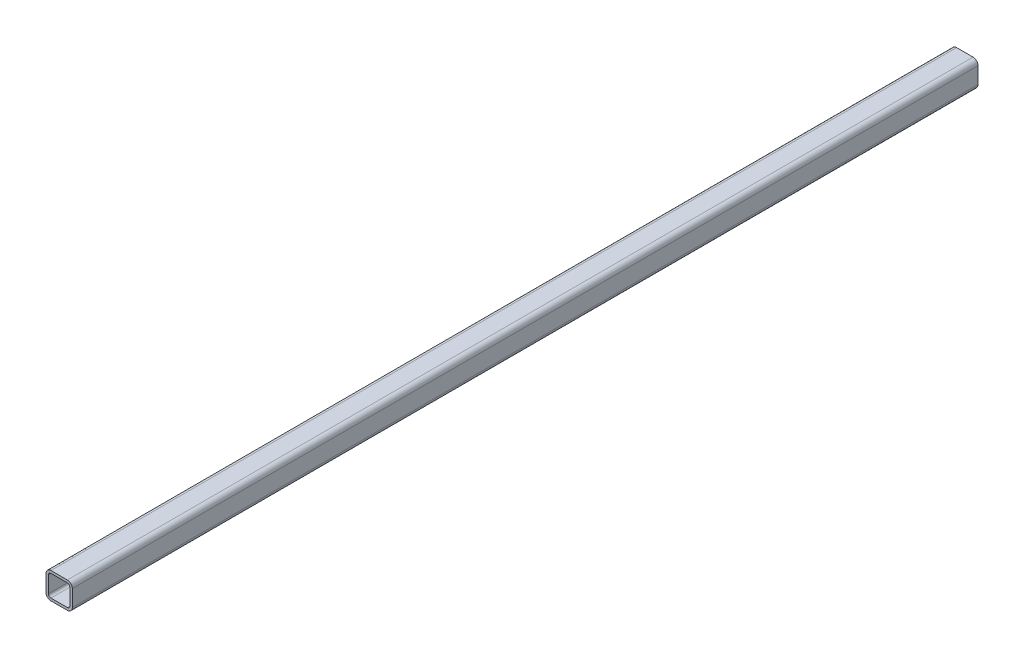
ISO-10303-21;
HEADER;
FILE_DESCRIPTION(('STEP AP214'),'2;1');
FILE_NAME('part.step','',(''),(''),'','','');
FILE_SCHEMA(('AUTOMOTIVE_DESIGN { 1 0 10303 214 1 1 1 1 }'));
ENDSEC;
DATA;
#1=APPLICATION_CONTEXT('core data for automotive mechanical design processes');
#2=APPLICATION_PROTOCOL_DEFINITION('international standard','automotive_design',2000,#1);
#3=PRODUCT_CONTEXT('',#1,'mechanical');
#4=PRODUCT('Part','Part','',(#3));
#5=PRODUCT_RELATED_PRODUCT_CATEGORY('part','',(#4));
#6=PRODUCT_DEFINITION_FORMATION('','',#4);
#7=PRODUCT_DEFINITION_CONTEXT('part definition',#1,'design');
#8=PRODUCT_DEFINITION('design','',#6,#7);
#9=PRODUCT_DEFINITION_SHAPE('','',#8);
#10=(LENGTH_UNIT() NAMED_UNIT(*) SI_UNIT(.MILLI.,.METRE.));
#11=(NAMED_UNIT(*) PLANE_ANGLE_UNIT() SI_UNIT($,.RADIAN.));
#12=(NAMED_UNIT(*) SI_UNIT($,.STERADIAN.) SOLID_ANGLE_UNIT());
#13=UNCERTAINTY_MEASURE_WITH_UNIT(LENGTH_MEASURE(1.E-05),#10,'distance_accuracy_value','');
#14=(GEOMETRIC_REPRESENTATION_CONTEXT(3) GLOBAL_UNCERTAINTY_ASSIGNED_CONTEXT((#13)) GLOBAL_UNIT_ASSIGNED_CONTEXT((#10,
#11,#12)) REPRESENTATION_CONTEXT('',''));
#15=CARTESIAN_POINT('',(0.,0.,0.));
#16=DIRECTION('',(0.,0.,1.));
#17=DIRECTION('',(1.,0.,0.));
#18=AXIS2_PLACEMENT_3D('',#15,#16,#17);
#19=CARTESIAN_POINT('',(41.27,41.27,1749.2));
#20=DIRECTION('',(0.,0.,-1.));
#21=DIRECTION('',(-1.,0.,0.));
#22=AXIS2_PLACEMENT_3D('',#19,#20,#21);
#23=PLANE('',#22);
#24=CARTESIAN_POINT('',(41.27,41.27,1749.2));
#25=DIRECTION('',(0.,0.,1.));
#26=DIRECTION('',(-1.,0.,0.));
#27=AXIS2_PLACEMENT_3D('',#24,#25,#26);
#28=CIRCLE('',#27,9.53);
#29=CARTESIAN_POINT('',(50.8,41.2699999999999,1749.2));
#30=VERTEX_POINT('',#29);
#31=CARTESIAN_POINT('',(41.2699999999999,50.8,1749.2));
#32=VERTEX_POINT('',#31);
#33=EDGE_CURVE('E246',#30,#32,#28,.T.);
#34=ORIENTED_EDGE('',*,*,#33,.T.);
#35=DIRECTION('',(-1.,0.,0.));
#36=VECTOR('',#35,1.);
#37=CARTESIAN_POINT('',(9.53000000000007,50.8,1749.2));
#38=LINE('',#37,#36);
#39=CARTESIAN_POINT('',(9.53000000000007,50.8,1749.2));
#40=VERTEX_POINT('',#39);
#41=EDGE_CURVE('E250',#32,#40,#38,.T.);
#42=ORIENTED_EDGE('',*,*,#41,.T.);
#43=CARTESIAN_POINT('',(9.53,41.27,1749.2));
#44=DIRECTION('',(0.,0.,1.));
#45=DIRECTION('',(-1.,0.,0.));
#46=AXIS2_PLACEMENT_3D('',#43,#44,#45);
#47=CIRCLE('',#46,9.53);
#48=CARTESIAN_POINT('',(0.,41.2699999999999,1749.2));
#49=VERTEX_POINT('',#48);
#50=EDGE_CURVE('E254',#40,#49,#47,.T.);
#51=ORIENTED_EDGE('',*,*,#50,.T.);
#52=DIRECTION('',(0.,-1.,0.));
#53=VECTOR('',#52,1.);
#54=CARTESIAN_POINT('',(0.,9.53000000000007,1749.2));
#55=LINE('',#54,#53);
#56=CARTESIAN_POINT('',(0.,9.53000000000007,1749.2));
#57=VERTEX_POINT('',#56);
#58=EDGE_CURVE('E257',#49,#57,#55,.T.);
#59=ORIENTED_EDGE('',*,*,#58,.T.);
#60=CARTESIAN_POINT('',(9.53,9.53,1749.2));
#61=DIRECTION('',(0.,0.,1.));
#62=DIRECTION('',(-1.,0.,0.));
#63=AXIS2_PLACEMENT_3D('',#60,#61,#62);
#64=CIRCLE('',#63,9.53);
#65=CARTESIAN_POINT('',(9.53000000000007,0.,1749.2));
#66=VERTEX_POINT('',#65);
#67=EDGE_CURVE('E260',#57,#66,#64,.T.);
#68=ORIENTED_EDGE('',*,*,#67,.T.);
#69=DIRECTION('',(1.,0.,0.));
#70=VECTOR('',#69,1.);
#71=CARTESIAN_POINT('',(9.53000000000007,0.,1749.2));
#72=LINE('',#71,#70);
#73=CARTESIAN_POINT('',(41.2699999999999,0.,1749.2));
#74=VERTEX_POINT('',#73);
#75=EDGE_CURVE('E263',#66,#74,#72,.T.);
#76=ORIENTED_EDGE('',*,*,#75,.T.);
#77=CARTESIAN_POINT('',(41.27,9.53,1749.2));
#78=DIRECTION('',(0.,0.,1.));
#79=DIRECTION('',(-1.,0.,0.));
#80=AXIS2_PLACEMENT_3D('',#77,#78,#79);
#81=CIRCLE('',#80,9.53);
#82=CARTESIAN_POINT('',(50.8,9.53000000000007,1749.2));
#83=VERTEX_POINT('',#82);
#84=EDGE_CURVE('E266',#74,#83,#81,.T.);
#85=ORIENTED_EDGE('',*,*,#84,.T.);
#86=DIRECTION('',(0.,1.,0.));
#87=VECTOR('',#86,1.);
#88=CARTESIAN_POINT('',(50.8,9.53000000000007,1749.2));
#89=LINE('',#88,#87);
#90=EDGE_CURVE('E269',#83,#30,#89,.T.);
#91=ORIENTED_EDGE('',*,*,#90,.T.);
#92=EDGE_LOOP('',(#34,#42,#51,#59,#68,#76,#85,#91));
#93=FACE_BOUND('',#92,.T.);
#94=CARTESIAN_POINT('',(9.52,9.52,1749.2));
#95=DIRECTION('',(0.,0.,1.));
#96=DIRECTION('',(1.,0.,0.));
#97=AXIS2_PLACEMENT_3D('',#94,#95,#96);
#98=CIRCLE('',#97,4.76);
#99=CARTESIAN_POINT('',(4.76,9.52000000000003,1749.2));
#100=VERTEX_POINT('',#99);
#101=CARTESIAN_POINT('',(9.52000000000004,4.76,1749.2));
#102=VERTEX_POINT('',#101);
#103=EDGE_CURVE('E157',#100,#102,#98,.T.);
#104=ORIENTED_EDGE('',*,*,#103,.F.);
#105=DIRECTION('',(0.,-1.,0.));
#106=VECTOR('',#105,1.);
#107=CARTESIAN_POINT('',(4.76,41.28,1749.2));
#108=LINE('',#107,#106);
#109=CARTESIAN_POINT('',(4.76,41.28,1749.2));
#110=VERTEX_POINT('',#109);
#111=EDGE_CURVE('E198',#110,#100,#108,.T.);
#112=ORIENTED_EDGE('',*,*,#111,.F.);
#113=CARTESIAN_POINT('',(9.52,41.28,1749.2));
#114=DIRECTION('',(0.,0.,1.));
#115=DIRECTION('',(-1.,0.,0.));
#116=AXIS2_PLACEMENT_3D('',#113,#114,#115);
#117=CIRCLE('',#116,4.76);
#118=CARTESIAN_POINT('',(9.52000000000003,46.04,1749.2));
#119=VERTEX_POINT('',#118);
#120=EDGE_CURVE('E195',#119,#110,#117,.T.);
#121=ORIENTED_EDGE('',*,*,#120,.F.);
#122=DIRECTION('',(-1.,0.,0.));
#123=VECTOR('',#122,1.);
#124=CARTESIAN_POINT('',(9.52000000000003,46.04,1749.2));
#125=LINE('',#124,#123);
#126=CARTESIAN_POINT('',(41.28,46.04,1749.2));
#127=VERTEX_POINT('',#126);
#128=EDGE_CURVE('E192',#127,#119,#125,.T.);
#129=ORIENTED_EDGE('',*,*,#128,.F.);
#130=CARTESIAN_POINT('',(41.28,41.28,1749.2));
#131=DIRECTION('',(0.,0.,1.));
#132=DIRECTION('',(1.,0.,0.));
#133=AXIS2_PLACEMENT_3D('',#130,#131,#132);
#134=CIRCLE('',#133,4.76);
#135=CARTESIAN_POINT('',(46.04,41.28,1749.2));
#136=VERTEX_POINT('',#135);
#137=EDGE_CURVE('E189',#136,#127,#134,.T.);
#138=ORIENTED_EDGE('',*,*,#137,.F.);
#139=DIRECTION('',(0.,1.,0.));
#140=VECTOR('',#139,1.);
#141=CARTESIAN_POINT('',(46.04,41.28,1749.2));
#142=LINE('',#141,#140);
#143=CARTESIAN_POINT('',(46.04,9.52000000000003,1749.2));
#144=VERTEX_POINT('',#143);
#145=EDGE_CURVE('E184',#144,#136,#142,.T.);
#146=ORIENTED_EDGE('',*,*,#145,.F.);
#147=CARTESIAN_POINT('',(41.28,9.52,1749.2));
#148=DIRECTION('',(0.,0.,1.));
#149=DIRECTION('',(1.,0.,0.));
#150=AXIS2_PLACEMENT_3D('',#147,#148,#149);
#151=CIRCLE('',#150,4.76);
#152=CARTESIAN_POINT('',(41.28,4.76,1749.2));
#153=VERTEX_POINT('',#152);
#154=EDGE_CURVE('E180',#153,#144,#151,.T.);
#155=ORIENTED_EDGE('',*,*,#154,.F.);
#156=DIRECTION('',(1.,0.,0.));
#157=VECTOR('',#156,1.);
#158=CARTESIAN_POINT('',(9.52000000000004,4.76,1749.2));
#159=LINE('',#158,#157);
#160=EDGE_CURVE('E166',#102,#153,#159,.T.);
#161=ORIENTED_EDGE('',*,*,#160,.F.);
#162=EDGE_LOOP('',(#104,#112,#121,#129,#138,#146,#155,#161));
#163=FACE_BOUND('',#162,.T.);
#164=ADVANCED_FACE('F43',(#93,#163),#23,.F.);
#165=CARTESIAN_POINT('',(41.27,41.27,0.));
#166=DIRECTION('',(0.,0.,-1.));
#167=DIRECTION('',(-1.,0.,0.));
#168=AXIS2_PLACEMENT_3D('',#165,#166,#167);
#169=PLANE('',#168);
#170=CARTESIAN_POINT('',(41.27,41.27,0.));
#171=DIRECTION('',(0.,0.,1.));
#172=DIRECTION('',(-1.,0.,0.));
#173=AXIS2_PLACEMENT_3D('',#170,#171,#172);
#174=CIRCLE('',#173,9.53);
#175=CARTESIAN_POINT('',(50.8,41.2699999999999,0.));
#176=VERTEX_POINT('',#175);
#177=CARTESIAN_POINT('',(41.2699999999999,50.8,0.));
#178=VERTEX_POINT('',#177);
#179=EDGE_CURVE('E175',#176,#178,#174,.T.);
#180=ORIENTED_EDGE('',*,*,#179,.F.);
#181=DIRECTION('',(0.,1.,0.));
#182=VECTOR('',#181,1.);
#183=CARTESIAN_POINT('',(50.8,9.53000000000007,0.));
#184=LINE('',#183,#182);
#185=CARTESIAN_POINT('',(50.8,9.53000000000007,0.));
#186=VERTEX_POINT('',#185);
#187=EDGE_CURVE('E251',#186,#176,#184,.T.);
#188=ORIENTED_EDGE('',*,*,#187,.F.);
#189=CARTESIAN_POINT('',(41.27,9.53,0.));
#190=DIRECTION('',(0.,0.,1.));
#191=DIRECTION('',(-1.,0.,0.));
#192=AXIS2_PLACEMENT_3D('',#189,#190,#191);
#193=CIRCLE('',#192,9.53);
#194=CARTESIAN_POINT('',(41.2699999999999,0.,0.));
#195=VERTEX_POINT('',#194);
#196=EDGE_CURVE('E291',#195,#186,#193,.T.);
#197=ORIENTED_EDGE('',*,*,#196,.F.);
#198=DIRECTION('',(1.,0.,0.));
#199=VECTOR('',#198,1.);
#200=CARTESIAN_POINT('',(9.53000000000007,0.,0.));
#201=LINE('',#200,#199);
#202=CARTESIAN_POINT('',(9.53000000000007,0.,0.));
#203=VERTEX_POINT('',#202);
#204=EDGE_CURVE('E288',#203,#195,#201,.T.);
#205=ORIENTED_EDGE('',*,*,#204,.F.);
#206=CARTESIAN_POINT('',(9.53,9.53,0.));
#207=DIRECTION('',(0.,0.,1.));
#208=DIRECTION('',(-1.,0.,0.));
#209=AXIS2_PLACEMENT_3D('',#206,#207,#208);
#210=CIRCLE('',#209,9.53);
#211=CARTESIAN_POINT('',(0.,9.53000000000007,0.));
#212=VERTEX_POINT('',#211);
#213=EDGE_CURVE('E285',#212,#203,#210,.T.);
#214=ORIENTED_EDGE('',*,*,#213,.F.);
#215=DIRECTION('',(0.,-1.,0.));
#216=VECTOR('',#215,1.);
#217=CARTESIAN_POINT('',(0.,9.53000000000007,0.));
#218=LINE('',#217,#216);
#219=CARTESIAN_POINT('',(0.,41.2699999999999,0.));
#220=VERTEX_POINT('',#219);
#221=EDGE_CURVE('E282',#220,#212,#218,.T.);
#222=ORIENTED_EDGE('',*,*,#221,.F.);
#223=CARTESIAN_POINT('',(9.53,41.27,0.));
#224=DIRECTION('',(0.,0.,1.));
#225=DIRECTION('',(-1.,0.,0.));
#226=AXIS2_PLACEMENT_3D('',#223,#224,#225);
#227=CIRCLE('',#226,9.53);
#228=CARTESIAN_POINT('',(9.53000000000007,50.8,0.));
#229=VERTEX_POINT('',#228);
#230=EDGE_CURVE('E279',#229,#220,#227,.T.);
#231=ORIENTED_EDGE('',*,*,#230,.F.);
#232=DIRECTION('',(-1.,0.,0.));
#233=VECTOR('',#232,1.);
#234=CARTESIAN_POINT('',(9.53000000000007,50.8,0.));
#235=LINE('',#234,#233);
#236=EDGE_CURVE('E276',#178,#229,#235,.T.);
#237=ORIENTED_EDGE('',*,*,#236,.F.);
#238=EDGE_LOOP('',(#180,#188,#197,#205,#214,#222,#231,#237));
#239=FACE_BOUND('',#238,.T.);
#240=DIRECTION('',(0.,-1.,0.));
#241=VECTOR('',#240,1.);
#242=CARTESIAN_POINT('',(4.76,41.28,0.));
#243=LINE('',#242,#241);
#244=CARTESIAN_POINT('',(4.76,41.28,0.));
#245=VERTEX_POINT('',#244);
#246=CARTESIAN_POINT('',(4.76,9.52000000000004,0.));
#247=VERTEX_POINT('',#246);
#248=EDGE_CURVE('E167',#245,#247,#243,.T.);
#249=ORIENTED_EDGE('',*,*,#248,.T.);
#250=CARTESIAN_POINT('',(9.52,9.52,0.));
#251=DIRECTION('',(0.,0.,1.));
#252=DIRECTION('',(1.,0.,0.));
#253=AXIS2_PLACEMENT_3D('',#250,#251,#252);
#254=CIRCLE('',#253,4.76);
#255=CARTESIAN_POINT('',(9.52000000000004,4.76,0.));
#256=VERTEX_POINT('',#255);
#257=EDGE_CURVE('E67',#247,#256,#254,.T.);
#258=ORIENTED_EDGE('',*,*,#257,.T.);
#259=DIRECTION('',(1.,0.,0.));
#260=VECTOR('',#259,1.);
#261=CARTESIAN_POINT('',(9.52000000000004,4.76,0.));
#262=LINE('',#261,#260);
#263=CARTESIAN_POINT('',(41.28,4.76,0.));
#264=VERTEX_POINT('',#263);
#265=EDGE_CURVE('E173',#256,#264,#262,.T.);
#266=ORIENTED_EDGE('',*,*,#265,.T.);
#267=CARTESIAN_POINT('',(41.28,9.52,0.));
#268=DIRECTION('',(0.,0.,1.));
#269=DIRECTION('',(1.,0.,0.));
#270=AXIS2_PLACEMENT_3D('',#267,#268,#269);
#271=CIRCLE('',#270,4.76);
#272=CARTESIAN_POINT('',(46.04,9.52000000000003,0.));
#273=VERTEX_POINT('',#272);
#274=EDGE_CURVE('E205',#264,#273,#271,.T.);
#275=ORIENTED_EDGE('',*,*,#274,.T.);
#276=DIRECTION('',(0.,1.,0.));
#277=VECTOR('',#276,1.);
#278=CARTESIAN_POINT('',(46.04,41.28,0.));
#279=LINE('',#278,#277);
#280=CARTESIAN_POINT('',(46.04,41.28,0.));
#281=VERTEX_POINT('',#280);
#282=EDGE_CURVE('E209',#273,#281,#279,.T.);
#283=ORIENTED_EDGE('',*,*,#282,.T.);
#284=CARTESIAN_POINT('',(41.28,41.28,0.));
#285=DIRECTION('',(0.,0.,1.));
#286=DIRECTION('',(1.,0.,0.));
#287=AXIS2_PLACEMENT_3D('',#284,#285,#286);
#288=CIRCLE('',#287,4.76);
#289=CARTESIAN_POINT('',(41.28,46.04,0.));
#290=VERTEX_POINT('',#289);
#291=EDGE_CURVE('E213',#281,#290,#288,.T.);
#292=ORIENTED_EDGE('',*,*,#291,.T.);
#293=DIRECTION('',(-1.,0.,0.));
#294=VECTOR('',#293,1.);
#295=CARTESIAN_POINT('',(9.52000000000003,46.04,0.));
#296=LINE('',#295,#294);
#297=CARTESIAN_POINT('',(9.52000000000003,46.04,0.));
#298=VERTEX_POINT('',#297);
#299=EDGE_CURVE('E217',#290,#298,#296,.T.);
#300=ORIENTED_EDGE('',*,*,#299,.T.);
#301=CARTESIAN_POINT('',(9.52,41.28,0.));
#302=DIRECTION('',(0.,0.,1.));
#303=DIRECTION('',(-1.,0.,0.));
#304=AXIS2_PLACEMENT_3D('',#301,#302,#303);
#305=CIRCLE('',#304,4.76);
#306=EDGE_CURVE('E221',#298,#245,#305,.T.);
#307=ORIENTED_EDGE('',*,*,#306,.T.);
#308=EDGE_LOOP('',(#249,#258,#266,#275,#283,#292,#300,#307));
#309=FACE_BOUND('',#308,.T.);
#310=ADVANCED_FACE('F330',(#239,#309),#169,.T.);
#311=CARTESIAN_POINT('',(41.27,41.27,1749.2));
#312=DIRECTION('',(0.,0.,-1.));
#313=DIRECTION('',(-1.,0.,0.));
#314=AXIS2_PLACEMENT_3D('',#311,#312,#313);
#315=CYLINDRICAL_SURFACE('',#314,9.53);
#316=ORIENTED_EDGE('',*,*,#179,.T.);
#317=DIRECTION('',(0.,0.,-1.));
#318=VECTOR('',#317,1.);
#319=CARTESIAN_POINT('',(41.2699999999999,50.8,1749.2));
#320=LINE('',#319,#318);
#321=EDGE_CURVE('E11',#32,#178,#320,.T.);
#322=ORIENTED_EDGE('',*,*,#321,.F.);
#323=ORIENTED_EDGE('',*,*,#33,.F.);
#324=DIRECTION('',(0.,0.,-1.));
#325=VECTOR('',#324,1.);
#326=CARTESIAN_POINT('',(50.8,41.2699999999999,1749.2));
#327=LINE('',#326,#325);
#328=EDGE_CURVE('E272',#30,#176,#327,.T.);
#329=ORIENTED_EDGE('',*,*,#328,.T.);
#330=EDGE_LOOP('',(#316,#322,#323,#329));
#331=FACE_BOUND('',#330,.T.);
#332=ADVANCED_FACE('F45',(#331),#315,.T.);
#333=CARTESIAN_POINT('',(9.53000000000007,50.8,1749.2));
#334=DIRECTION('',(0.,-1.,0.));
#335=DIRECTION('',(0.,0.,-1.));
#336=AXIS2_PLACEMENT_3D('',#333,#334,#335);
#337=PLANE('',#336);
#338=ORIENTED_EDGE('',*,*,#236,.T.);
#339=DIRECTION('',(0.,0.,-1.));
#340=VECTOR('',#339,1.);
#341=CARTESIAN_POINT('',(9.53000000000007,50.8,1749.2));
#342=LINE('',#341,#340);
#343=EDGE_CURVE('E52',#40,#229,#342,.T.);
#344=ORIENTED_EDGE('',*,*,#343,.F.);
#345=ORIENTED_EDGE('',*,*,#41,.F.);
#346=ORIENTED_EDGE('',*,*,#321,.T.);
#347=EDGE_LOOP('',(#338,#344,#345,#346));
#348=FACE_BOUND('',#347,.T.);
#349=ADVANCED_FACE('F347',(#348),#337,.F.);
#350=CARTESIAN_POINT('',(9.53,41.27,1749.2));
#351=DIRECTION('',(0.,0.,-1.));
#352=DIRECTION('',(-1.,0.,0.));
#353=AXIS2_PLACEMENT_3D('',#350,#351,#352);
#354=CYLINDRICAL_SURFACE('',#353,9.53);
#355=ORIENTED_EDGE('',*,*,#230,.T.);
#356=DIRECTION('',(0.,0.,-1.));
#357=VECTOR('',#356,1.);
#358=CARTESIAN_POINT('',(0.,41.2699999999999,1749.2));
#359=LINE('',#358,#357);
#360=EDGE_CURVE('E315',#49,#220,#359,.T.);
#361=ORIENTED_EDGE('',*,*,#360,.F.);
#362=ORIENTED_EDGE('',*,*,#50,.F.);
#363=ORIENTED_EDGE('',*,*,#343,.T.);
#364=EDGE_LOOP('',(#355,#361,#362,#363));
#365=FACE_BOUND('',#364,.T.);
#366=ADVANCED_FACE('F324',(#365),#354,.T.);
#367=CARTESIAN_POINT('',(0.,9.53000000000007,1749.2));
#368=DIRECTION('',(1.,0.,0.));
#369=DIRECTION('',(0.,0.,-1.));
#370=AXIS2_PLACEMENT_3D('',#367,#368,#369);
#371=PLANE('',#370);
#372=ORIENTED_EDGE('',*,*,#221,.T.);
#373=DIRECTION('',(0.,0.,-1.));
#374=VECTOR('',#373,1.);
#375=CARTESIAN_POINT('',(0.,9.53000000000007,1749.2));
#376=LINE('',#375,#374);
#377=EDGE_CURVE('E311',#57,#212,#376,.T.);
#378=ORIENTED_EDGE('',*,*,#377,.F.);
#379=ORIENTED_EDGE('',*,*,#58,.F.);
#380=ORIENTED_EDGE('',*,*,#360,.T.);
#381=EDGE_LOOP('',(#372,#378,#379,#380));
#382=FACE_BOUND('',#381,.T.);
#383=ADVANCED_FACE('F336',(#382),#371,.F.);
#384=CARTESIAN_POINT('',(9.53,9.53,1749.2));
#385=DIRECTION('',(0.,0.,-1.));
#386=DIRECTION('',(-1.,0.,0.));
#387=AXIS2_PLACEMENT_3D('',#384,#385,#386);
#388=CYLINDRICAL_SURFACE('',#387,9.53);
#389=ORIENTED_EDGE('',*,*,#213,.T.);
#390=DIRECTION('',(0.,0.,-1.));
#391=VECTOR('',#390,1.);
#392=CARTESIAN_POINT('',(9.53000000000007,0.,1749.2));
#393=LINE('',#392,#391);
#394=EDGE_CURVE('E307',#66,#203,#393,.T.);
#395=ORIENTED_EDGE('',*,*,#394,.F.);
#396=ORIENTED_EDGE('',*,*,#67,.F.);
#397=ORIENTED_EDGE('',*,*,#377,.T.);
#398=EDGE_LOOP('',(#389,#395,#396,#397));
#399=FACE_BOUND('',#398,.T.);
#400=ADVANCED_FACE('F340',(#399),#388,.T.);
#401=CARTESIAN_POINT('',(9.53000000000007,0.,1749.2));
#402=DIRECTION('',(0.,1.,0.));
#403=DIRECTION('',(0.,0.,1.));
#404=AXIS2_PLACEMENT_3D('',#401,#402,#403);
#405=PLANE('',#404);
#406=ORIENTED_EDGE('',*,*,#204,.T.);
#407=DIRECTION('',(0.,0.,-1.));
#408=VECTOR('',#407,1.);
#409=CARTESIAN_POINT('',(41.2699999999999,0.,1749.2));
#410=LINE('',#409,#408);
#411=EDGE_CURVE('E303',#74,#195,#410,.T.);
#412=ORIENTED_EDGE('',*,*,#411,.F.);
#413=ORIENTED_EDGE('',*,*,#75,.F.);
#414=ORIENTED_EDGE('',*,*,#394,.T.);
#415=EDGE_LOOP('',(#406,#412,#413,#414));
#416=FACE_BOUND('',#415,.T.);
#417=ADVANCED_FACE('F360',(#416),#405,.F.);
#418=CARTESIAN_POINT('',(41.27,9.53,1749.2));
#419=DIRECTION('',(0.,0.,-1.));
#420=DIRECTION('',(-1.,0.,0.));
#421=AXIS2_PLACEMENT_3D('',#418,#419,#420);
#422=CYLINDRICAL_SURFACE('',#421,9.53);
#423=ORIENTED_EDGE('',*,*,#196,.T.);
#424=DIRECTION('',(0.,0.,-1.));
#425=VECTOR('',#424,1.);
#426=CARTESIAN_POINT('',(50.8,9.53000000000007,1749.2));
#427=LINE('',#426,#425);
#428=EDGE_CURVE('E299',#83,#186,#427,.T.);
#429=ORIENTED_EDGE('',*,*,#428,.F.);
#430=ORIENTED_EDGE('',*,*,#84,.F.);
#431=ORIENTED_EDGE('',*,*,#411,.T.);
#432=EDGE_LOOP('',(#423,#429,#430,#431));
#433=FACE_BOUND('',#432,.T.);
#434=ADVANCED_FACE('F358',(#433),#422,.T.);
#435=CARTESIAN_POINT('',(50.8,9.53000000000007,1749.2));
#436=DIRECTION('',(-1.,0.,0.));
#437=DIRECTION('',(0.,0.,1.));
#438=AXIS2_PLACEMENT_3D('',#435,#436,#437);
#439=PLANE('',#438);
#440=ORIENTED_EDGE('',*,*,#187,.T.);
#441=ORIENTED_EDGE('',*,*,#328,.F.);
#442=ORIENTED_EDGE('',*,*,#90,.F.);
#443=ORIENTED_EDGE('',*,*,#428,.T.);
#444=EDGE_LOOP('',(#440,#441,#442,#443));
#445=FACE_BOUND('',#444,.T.);
#446=ADVANCED_FACE('F353',(#445),#439,.F.);
#447=CARTESIAN_POINT('',(9.52,9.52,1749.2));
#448=DIRECTION('',(0.,0.,-1.));
#449=DIRECTION('',(-1.,0.,0.));
#450=AXIS2_PLACEMENT_3D('',#447,#448,#449);
#451=CYLINDRICAL_SURFACE('',#450,4.76);
#452=ORIENTED_EDGE('',*,*,#257,.F.);
#453=DIRECTION('',(0.,0.,-1.));
#454=VECTOR('',#453,1.);
#455=CARTESIAN_POINT('',(4.76,9.52000000000003,1749.2));
#456=LINE('',#455,#454);
#457=EDGE_CURVE('E161',#100,#247,#456,.T.);
#458=ORIENTED_EDGE('',*,*,#457,.F.);
#459=ORIENTED_EDGE('',*,*,#103,.T.);
#460=DIRECTION('',(0.,0.,-1.));
#461=VECTOR('',#460,1.);
#462=CARTESIAN_POINT('',(9.52000000000004,4.76,1749.2));
#463=LINE('',#462,#461);
#464=EDGE_CURVE('E160',#102,#256,#463,.T.);
#465=ORIENTED_EDGE('',*,*,#464,.T.);
#466=EDGE_LOOP('',(#452,#458,#459,#465));
#467=FACE_BOUND('',#466,.T.);
#468=ADVANCED_FACE('F159',(#467),#451,.F.);
#469=CARTESIAN_POINT('',(9.52000000000004,4.76,1749.2));
#470=DIRECTION('',(0.,1.,0.));
#471=DIRECTION('',(-1.,0.,0.));
#472=AXIS2_PLACEMENT_3D('',#469,#470,#471);
#473=PLANE('',#472);
#474=ORIENTED_EDGE('',*,*,#265,.F.);
#475=ORIENTED_EDGE('',*,*,#464,.F.);
#476=ORIENTED_EDGE('',*,*,#160,.T.);
#477=DIRECTION('',(0.,0.,-1.));
#478=VECTOR('',#477,1.);
#479=CARTESIAN_POINT('',(41.28,4.76,1749.2));
#480=LINE('',#479,#478);
#481=EDGE_CURVE('E176',#153,#264,#480,.T.);
#482=ORIENTED_EDGE('',*,*,#481,.T.);
#483=EDGE_LOOP('',(#474,#475,#476,#482));
#484=FACE_BOUND('',#483,.T.);
#485=ADVANCED_FACE('F170',(#484),#473,.T.);
#486=CARTESIAN_POINT('',(41.28,9.52,1749.2));
#487=DIRECTION('',(0.,0.,-1.));
#488=DIRECTION('',(-1.,0.,0.));
#489=AXIS2_PLACEMENT_3D('',#486,#487,#488);
#490=CYLINDRICAL_SURFACE('',#489,4.76);
#491=ORIENTED_EDGE('',*,*,#274,.F.);
#492=ORIENTED_EDGE('',*,*,#481,.F.);
#493=ORIENTED_EDGE('',*,*,#154,.T.);
#494=DIRECTION('',(0.,0.,-1.));
#495=VECTOR('',#494,1.);
#496=CARTESIAN_POINT('',(46.04,9.52000000000003,1749.2));
#497=LINE('',#496,#495);
#498=EDGE_CURVE('E241',#144,#273,#497,.T.);
#499=ORIENTED_EDGE('',*,*,#498,.T.);
#500=EDGE_LOOP('',(#491,#492,#493,#499));
#501=FACE_BOUND('',#500,.T.);
#502=ADVANCED_FACE('F385',(#501),#490,.F.);
#503=CARTESIAN_POINT('',(46.04,41.28,1749.2));
#504=DIRECTION('',(-1.,0.,0.));
#505=DIRECTION('',(0.,-1.,0.));
#506=AXIS2_PLACEMENT_3D('',#503,#504,#505);
#507=PLANE('',#506);
#508=ORIENTED_EDGE('',*,*,#282,.F.);
#509=ORIENTED_EDGE('',*,*,#498,.F.);
#510=ORIENTED_EDGE('',*,*,#145,.T.);
#511=DIRECTION('',(0.,0.,-1.));
#512=VECTOR('',#511,1.);
#513=CARTESIAN_POINT('',(46.04,41.28,1749.2));
#514=LINE('',#513,#512);
#515=EDGE_CURVE('E238',#136,#281,#514,.T.);
#516=ORIENTED_EDGE('',*,*,#515,.T.);
#517=EDGE_LOOP('',(#508,#509,#510,#516));
#518=FACE_BOUND('',#517,.T.);
#519=ADVANCED_FACE('F389',(#518),#507,.T.);
#520=CARTESIAN_POINT('',(41.28,41.28,1749.2));
#521=DIRECTION('',(0.,0.,-1.));
#522=DIRECTION('',(-1.,0.,0.));
#523=AXIS2_PLACEMENT_3D('',#520,#521,#522);
#524=CYLINDRICAL_SURFACE('',#523,4.76);
#525=ORIENTED_EDGE('',*,*,#291,.F.);
#526=ORIENTED_EDGE('',*,*,#515,.F.);
#527=ORIENTED_EDGE('',*,*,#137,.T.);
#528=DIRECTION('',(0.,0.,-1.));
#529=VECTOR('',#528,1.);
#530=CARTESIAN_POINT('',(41.28,46.04,1749.2));
#531=LINE('',#530,#529);
#532=EDGE_CURVE('E235',#127,#290,#531,.T.);
#533=ORIENTED_EDGE('',*,*,#532,.T.);
#534=EDGE_LOOP('',(#525,#526,#527,#533));
#535=FACE_BOUND('',#534,.T.);
#536=ADVANCED_FACE('F395',(#535),#524,.F.);
#537=CARTESIAN_POINT('',(9.52000000000003,46.04,1749.2));
#538=DIRECTION('',(0.,-1.,0.));
#539=DIRECTION('',(0.,0.,-1.));
#540=AXIS2_PLACEMENT_3D('',#537,#538,#539);
#541=PLANE('',#540);
#542=ORIENTED_EDGE('',*,*,#299,.F.);
#543=ORIENTED_EDGE('',*,*,#532,.F.);
#544=ORIENTED_EDGE('',*,*,#128,.T.);
#545=DIRECTION('',(0.,0.,-1.));
#546=VECTOR('',#545,1.);
#547=CARTESIAN_POINT('',(9.52000000000003,46.04,1749.2));
#548=LINE('',#547,#546);
#549=EDGE_CURVE('E232',#119,#298,#548,.T.);
#550=ORIENTED_EDGE('',*,*,#549,.T.);
#551=EDGE_LOOP('',(#542,#543,#544,#550));
#552=FACE_BOUND('',#551,.T.);
#553=ADVANCED_FACE('F399',(#552),#541,.T.);
#554=CARTESIAN_POINT('',(9.52,41.28,1749.2));
#555=DIRECTION('',(0.,0.,-1.));
#556=DIRECTION('',(-1.,0.,0.));
#557=AXIS2_PLACEMENT_3D('',#554,#555,#556);
#558=CYLINDRICAL_SURFACE('',#557,4.76);
#559=ORIENTED_EDGE('',*,*,#306,.F.);
#560=ORIENTED_EDGE('',*,*,#549,.F.);
#561=ORIENTED_EDGE('',*,*,#120,.T.);
#562=DIRECTION('',(0.,0.,-1.));
#563=VECTOR('',#562,1.);
#564=CARTESIAN_POINT('',(4.76,41.28,1749.2));
#565=LINE('',#564,#563);
#566=EDGE_CURVE('E59',#110,#245,#565,.T.);
#567=ORIENTED_EDGE('',*,*,#566,.T.);
#568=EDGE_LOOP('',(#559,#560,#561,#567));
#569=FACE_BOUND('',#568,.T.);
#570=ADVANCED_FACE('F403',(#569),#558,.F.);
#571=CARTESIAN_POINT('',(4.76,41.28,1749.2));
#572=DIRECTION('',(1.,0.,0.));
#573=DIRECTION('',(0.,1.,0.));
#574=AXIS2_PLACEMENT_3D('',#571,#572,#573);
#575=PLANE('',#574);
#576=ORIENTED_EDGE('',*,*,#248,.F.);
#577=ORIENTED_EDGE('',*,*,#566,.F.);
#578=ORIENTED_EDGE('',*,*,#111,.T.);
#579=ORIENTED_EDGE('',*,*,#457,.T.);
#580=EDGE_LOOP('',(#576,#577,#578,#579));
#581=FACE_BOUND('',#580,.T.);
#582=ADVANCED_FACE('F407',(#581),#575,.T.);
#583=CLOSED_SHELL('',(#164,#310,#332,#349,#366,#383,#400,#417,#434,#446,#468,#485,#502,#519,
#536,#553,#570,#582));
#584=MANIFOLD_SOLID_BREP('B2',#583);
#585=ADVANCED_BREP_SHAPE_REPRESENTATION('',(#18,#584),#14);
#586=SHAPE_DEFINITION_REPRESENTATION(#9,#585);
ENDSEC;
END-ISO-10303-21;
